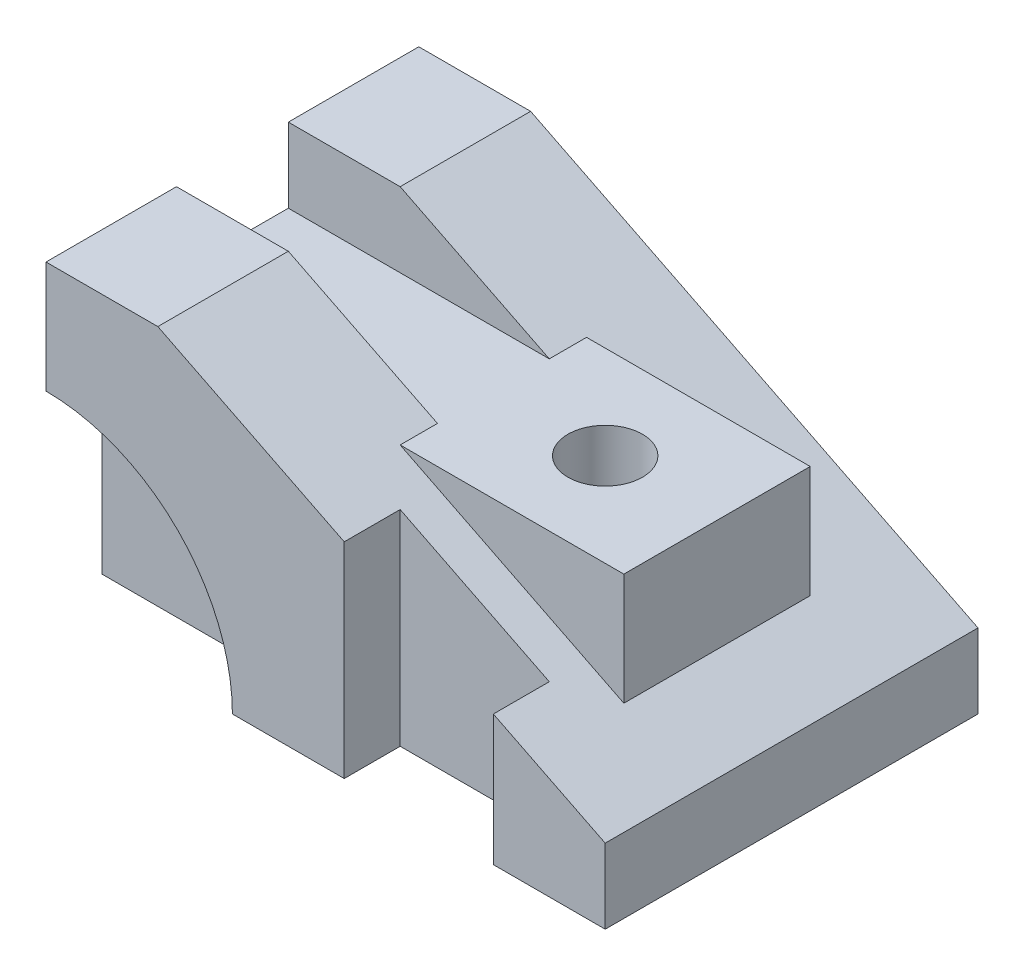
ISO-10303-21;
HEADER;
FILE_DESCRIPTION(('STEP AP214'),'2;1');
FILE_NAME('part.step','',(''),(''),'','','');
FILE_SCHEMA(('AUTOMOTIVE_DESIGN { 1 0 10303 214 1 1 1 1 }'));
ENDSEC;
DATA;
#1=APPLICATION_CONTEXT('core data for automotive mechanical design processes');
#2=APPLICATION_PROTOCOL_DEFINITION('international standard','automotive_design',2000,#1);
#3=PRODUCT_CONTEXT('',#1,'mechanical');
#4=PRODUCT('Part','Part','',(#3));
#5=PRODUCT_RELATED_PRODUCT_CATEGORY('part','',(#4));
#6=PRODUCT_DEFINITION_FORMATION('','',#4);
#7=PRODUCT_DEFINITION_CONTEXT('part definition',#1,'design');
#8=PRODUCT_DEFINITION('design','',#6,#7);
#9=PRODUCT_DEFINITION_SHAPE('','',#8);
#10=(LENGTH_UNIT() NAMED_UNIT(*) SI_UNIT(.MILLI.,.METRE.));
#11=(NAMED_UNIT(*) PLANE_ANGLE_UNIT() SI_UNIT($,.RADIAN.));
#12=(NAMED_UNIT(*) SI_UNIT($,.STERADIAN.) SOLID_ANGLE_UNIT());
#13=UNCERTAINTY_MEASURE_WITH_UNIT(LENGTH_MEASURE(1.E-05),#10,'distance_accuracy_value','');
#14=(GEOMETRIC_REPRESENTATION_CONTEXT(3) GLOBAL_UNCERTAINTY_ASSIGNED_CONTEXT((#13)) GLOBAL_UNIT_ASSIGNED_CONTEXT((#10,
#11,#12)) REPRESENTATION_CONTEXT('',''));
#15=CARTESIAN_POINT('',(0.,0.,0.));
#16=DIRECTION('',(0.,0.,1.));
#17=DIRECTION('',(1.,0.,0.));
#18=AXIS2_PLACEMENT_3D('',#15,#16,#17);
#19=CARTESIAN_POINT('',(0.,0.,50.));
#20=DIRECTION('',(0.,0.,1.));
#21=DIRECTION('',(1.,0.,0.));
#22=AXIS2_PLACEMENT_3D('',#19,#20,#21);
#23=PLANE('',#22);
#24=DIRECTION('',(0.,-1.,0.));
#25=VECTOR('',#24,1.);
#26=CARTESIAN_POINT('',(80.,0.,50.));
#27=LINE('',#26,#25);
#28=CARTESIAN_POINT('',(80.,55.,50.));
#29=VERTEX_POINT('',#28);
#30=CARTESIAN_POINT('',(80.,0.,50.));
#31=VERTEX_POINT('',#30);
#32=EDGE_CURVE('E11',#29,#31,#27,.T.);
#33=ORIENTED_EDGE('',*,*,#32,.F.);
#34=DIRECTION('',(-0.894427190999916,0.447213595499958,0.));
#35=VECTOR('',#34,1.);
#36=CARTESIAN_POINT('',(150.,20.,50.));
#37=LINE('',#36,#35);
#38=CARTESIAN_POINT('',(30.,80.,50.));
#39=VERTEX_POINT('',#38);
#40=EDGE_CURVE('E331',#29,#39,#37,.T.);
#41=ORIENTED_EDGE('',*,*,#40,.T.);
#42=DIRECTION('',(-1.,0.,0.));
#43=VECTOR('',#42,1.);
#44=CARTESIAN_POINT('',(30.,80.,50.));
#45=LINE('',#44,#43);
#46=CARTESIAN_POINT('',(0.,80.,50.));
#47=VERTEX_POINT('',#46);
#48=EDGE_CURVE('E336',#39,#47,#45,.T.);
#49=ORIENTED_EDGE('',*,*,#48,.T.);
#50=DIRECTION('',(0.,-1.,0.));
#51=VECTOR('',#50,1.);
#52=CARTESIAN_POINT('',(0.,80.,50.));
#53=LINE('',#52,#51);
#54=CARTESIAN_POINT('',(0.,50.,50.));
#55=VERTEX_POINT('',#54);
#56=EDGE_CURVE('E320',#47,#55,#53,.T.);
#57=ORIENTED_EDGE('',*,*,#56,.T.);
#58=CARTESIAN_POINT('',(0.,0.,50.));
#59=DIRECTION('',(0.,0.,1.));
#60=DIRECTION('',(1.,0.,0.));
#61=AXIS2_PLACEMENT_3D('',#58,#59,#60);
#62=CIRCLE('',#61,50.);
#63=CARTESIAN_POINT('',(50.,0.,50.));
#64=VERTEX_POINT('',#63);
#65=EDGE_CURVE('E275',#64,#55,#62,.T.);
#66=ORIENTED_EDGE('',*,*,#65,.F.);
#67=DIRECTION('',(1.,0.,0.));
#68=VECTOR('',#67,1.);
#69=CARTESIAN_POINT('',(0.,0.,50.));
#70=LINE('',#69,#68);
#71=EDGE_CURVE('E325',#64,#31,#70,.T.);
#72=ORIENTED_EDGE('',*,*,#71,.T.);
#73=EDGE_LOOP('',(#33,#41,#49,#57,#66,#72));
#74=FACE_BOUND('',#73,.T.);
#75=ADVANCED_FACE('F45',(#74),#23,.T.);
#76=CARTESIAN_POINT('',(0.,80.,50.));
#77=DIRECTION('',(1.,0.,0.));
#78=DIRECTION('',(0.,1.,0.));
#79=AXIS2_PLACEMENT_3D('',#76,#77,#78);
#80=PLANE('',#79);
#81=DIRECTION('',(0.,1.,0.));
#82=VECTOR('',#81,1.);
#83=CARTESIAN_POINT('',(0.,80.,15.));
#84=LINE('',#83,#82);
#85=CARTESIAN_POINT('',(0.,60.,15.));
#86=VERTEX_POINT('',#85);
#87=CARTESIAN_POINT('',(0.,80.,15.));
#88=VERTEX_POINT('',#87);
#89=EDGE_CURVE('E240',#86,#88,#84,.T.);
#90=ORIENTED_EDGE('',*,*,#89,.F.);
#91=DIRECTION('',(0.,0.,1.));
#92=VECTOR('',#91,1.);
#93=CARTESIAN_POINT('',(0.,60.,50.));
#94=LINE('',#93,#92);
#95=CARTESIAN_POINT('',(0.,60.,-15.));
#96=VERTEX_POINT('',#95);
#97=EDGE_CURVE('E243',#96,#86,#94,.T.);
#98=ORIENTED_EDGE('',*,*,#97,.F.);
#99=DIRECTION('',(0.,1.,0.));
#100=VECTOR('',#99,1.);
#101=CARTESIAN_POINT('',(0.,80.,-15.));
#102=LINE('',#101,#100);
#103=CARTESIAN_POINT('',(0.,80.,-15.));
#104=VERTEX_POINT('',#103);
#105=EDGE_CURVE('E233',#96,#104,#102,.T.);
#106=ORIENTED_EDGE('',*,*,#105,.T.);
#107=DIRECTION('',(0.,0.,-1.));
#108=VECTOR('',#107,1.);
#109=CARTESIAN_POINT('',(0.,80.,50.));
#110=LINE('',#109,#108);
#111=CARTESIAN_POINT('',(0.,80.,-50.));
#112=VERTEX_POINT('',#111);
#113=EDGE_CURVE('E339',#104,#112,#110,.T.);
#114=ORIENTED_EDGE('',*,*,#113,.T.);
#115=DIRECTION('',(0.,-1.,0.));
#116=VECTOR('',#115,1.);
#117=CARTESIAN_POINT('',(0.,80.,-50.));
#118=LINE('',#117,#116);
#119=CARTESIAN_POINT('',(0.,0.,-50.));
#120=VERTEX_POINT('',#119);
#121=EDGE_CURVE('E300',#112,#120,#118,.T.);
#122=ORIENTED_EDGE('',*,*,#121,.T.);
#123=DIRECTION('',(0.,0.,-1.));
#124=VECTOR('',#123,1.);
#125=CARTESIAN_POINT('',(0.,0.,50.));
#126=LINE('',#125,#124);
#127=CARTESIAN_POINT('',(0.,0.,35.));
#128=VERTEX_POINT('',#127);
#129=EDGE_CURVE('E355',#128,#120,#126,.T.);
#130=ORIENTED_EDGE('',*,*,#129,.F.);
#131=DIRECTION('',(0.,-1.,0.));
#132=VECTOR('',#131,1.);
#133=CARTESIAN_POINT('',(0.,80.,35.));
#134=LINE('',#133,#132);
#135=CARTESIAN_POINT('',(0.,50.,35.));
#136=VERTEX_POINT('',#135);
#137=EDGE_CURVE('E297',#136,#128,#134,.T.);
#138=ORIENTED_EDGE('',*,*,#137,.F.);
#139=DIRECTION('',(0.,0.,1.));
#140=VECTOR('',#139,1.);
#141=CARTESIAN_POINT('',(0.,50.,35.));
#142=LINE('',#141,#140);
#143=EDGE_CURVE('E293',#136,#55,#142,.T.);
#144=ORIENTED_EDGE('',*,*,#143,.T.);
#145=ORIENTED_EDGE('',*,*,#56,.F.);
#146=EDGE_CURVE('E340',#47,#88,#110,.T.);
#147=ORIENTED_EDGE('',*,*,#146,.T.);
#148=EDGE_LOOP('',(#90,#98,#106,#114,#122,#130,#138,#144,#145,#147));
#149=FACE_BOUND('',#148,.T.);
#150=ADVANCED_FACE('F47',(#149),#80,.F.);
#151=CARTESIAN_POINT('',(150.,20.,50.));
#152=DIRECTION('',(-0.447213595499958,-0.894427190999916,0.));
#153=DIRECTION('',(0.894427190999916,-0.447213595499958,0.));
#154=AXIS2_PLACEMENT_3D('',#151,#152,#153);
#155=PLANE('',#154);
#156=ORIENTED_EDGE('',*,*,#40,.F.);
#157=DIRECTION('',(0.,0.,-1.));
#158=VECTOR('',#157,1.);
#159=CARTESIAN_POINT('',(80.,55.,50.0000000000001));
#160=LINE('',#159,#158);
#161=CARTESIAN_POINT('',(80.,55.,35.));
#162=VERTEX_POINT('',#161);
#163=EDGE_CURVE('E205',#29,#162,#160,.T.);
#164=ORIENTED_EDGE('',*,*,#163,.T.);
#165=DIRECTION('',(0.894427190999916,-0.447213595499958,0.));
#166=VECTOR('',#165,1.);
#167=CARTESIAN_POINT('',(150.,20.,35.));
#168=LINE('',#167,#166);
#169=CARTESIAN_POINT('',(120.,35.,35.));
#170=VERTEX_POINT('',#169);
#171=EDGE_CURVE('E177',#162,#170,#168,.T.);
#172=ORIENTED_EDGE('',*,*,#171,.T.);
#173=DIRECTION('',(0.,0.,1.));
#174=VECTOR('',#173,1.);
#175=CARTESIAN_POINT('',(120.,35.,50.));
#176=LINE('',#175,#174);
#177=CARTESIAN_POINT('',(120.,35.,50.));
#178=VERTEX_POINT('',#177);
#179=EDGE_CURVE('E200',#170,#178,#176,.T.);
#180=ORIENTED_EDGE('',*,*,#179,.T.);
#181=CARTESIAN_POINT('',(150.,20.,50.));
#182=VERTEX_POINT('',#181);
#183=EDGE_CURVE('E332',#182,#178,#37,.T.);
#184=ORIENTED_EDGE('',*,*,#183,.F.);
#185=DIRECTION('',(0.,0.,-1.));
#186=VECTOR('',#185,1.);
#187=CARTESIAN_POINT('',(150.,20.,50.));
#188=LINE('',#187,#186);
#189=CARTESIAN_POINT('',(150.,20.,-50.));
#190=VERTEX_POINT('',#189);
#191=EDGE_CURVE('E349',#182,#190,#188,.T.);
#192=ORIENTED_EDGE('',*,*,#191,.T.);
#193=DIRECTION('',(-0.894427190999916,0.447213595499958,0.));
#194=VECTOR('',#193,1.);
#195=CARTESIAN_POINT('',(150.,20.,-50.));
#196=LINE('',#195,#194);
#197=CARTESIAN_POINT('',(30.,80.,-50.));
#198=VERTEX_POINT('',#197);
#199=EDGE_CURVE('E312',#190,#198,#196,.T.);
#200=ORIENTED_EDGE('',*,*,#199,.T.);
#201=DIRECTION('',(0.,0.,-1.));
#202=VECTOR('',#201,1.);
#203=CARTESIAN_POINT('',(30.,80.,50.));
#204=LINE('',#203,#202);
#205=CARTESIAN_POINT('',(30.,80.,-15.));
#206=VERTEX_POINT('',#205);
#207=EDGE_CURVE('E344',#206,#198,#204,.T.);
#208=ORIENTED_EDGE('',*,*,#207,.F.);
#209=DIRECTION('',(0.894427190999916,-0.447213595499958,0.));
#210=VECTOR('',#209,1.);
#211=CARTESIAN_POINT('',(150.,20.,-15.));
#212=LINE('',#211,#210);
#213=CARTESIAN_POINT('',(70.,60.,-15.));
#214=VERTEX_POINT('',#213);
#215=EDGE_CURVE('E69',#206,#214,#212,.T.);
#216=ORIENTED_EDGE('',*,*,#215,.T.);
#217=DIRECTION('',(0.,0.,1.));
#218=VECTOR('',#217,1.);
#219=CARTESIAN_POINT('',(70.,60.,-25.));
#220=LINE('',#219,#218);
#221=CARTESIAN_POINT('',(70.,60.,-25.));
#222=VERTEX_POINT('',#221);
#223=EDGE_CURVE('E271',#222,#214,#220,.T.);
#224=ORIENTED_EDGE('',*,*,#223,.F.);
#225=DIRECTION('',(0.894427190999916,-0.447213595499958,0.));
#226=VECTOR('',#225,1.);
#227=CARTESIAN_POINT('',(130.,30.,-25.));
#228=LINE('',#227,#226);
#229=CARTESIAN_POINT('',(130.,30.,-25.));
#230=VERTEX_POINT('',#229);
#231=EDGE_CURVE('E258',#222,#230,#228,.T.);
#232=ORIENTED_EDGE('',*,*,#231,.T.);
#233=DIRECTION('',(0.,0.,1.));
#234=VECTOR('',#233,1.);
#235=CARTESIAN_POINT('',(130.,30.,-25.));
#236=LINE('',#235,#234);
#237=CARTESIAN_POINT('',(130.,30.,25.));
#238=VERTEX_POINT('',#237);
#239=EDGE_CURVE('E270',#230,#238,#236,.T.);
#240=ORIENTED_EDGE('',*,*,#239,.T.);
#241=DIRECTION('',(0.894427190999916,-0.447213595499958,0.));
#242=VECTOR('',#241,1.);
#243=CARTESIAN_POINT('',(130.,30.,25.));
#244=LINE('',#243,#242);
#245=CARTESIAN_POINT('',(70.,60.,25.));
#246=VERTEX_POINT('',#245);
#247=EDGE_CURVE('E246',#246,#238,#244,.T.);
#248=ORIENTED_EDGE('',*,*,#247,.F.);
#249=CARTESIAN_POINT('',(70.,60.,15.));
#250=VERTEX_POINT('',#249);
#251=EDGE_CURVE('E276',#250,#246,#220,.T.);
#252=ORIENTED_EDGE('',*,*,#251,.F.);
#253=DIRECTION('',(0.894427190999916,-0.447213595499958,0.));
#254=VECTOR('',#253,1.);
#255=CARTESIAN_POINT('',(150.,20.,15.));
#256=LINE('',#255,#254);
#257=CARTESIAN_POINT('',(30.,80.,15.));
#258=VERTEX_POINT('',#257);
#259=EDGE_CURVE('E237',#258,#250,#256,.T.);
#260=ORIENTED_EDGE('',*,*,#259,.F.);
#261=EDGE_CURVE('E345',#39,#258,#204,.T.);
#262=ORIENTED_EDGE('',*,*,#261,.F.);
#263=EDGE_LOOP('',(#156,#164,#172,#180,#184,#192,#200,#208,#216,#224,#232,#240,#248,#252,#260,#262));
#264=FACE_BOUND('',#263,.T.);
#265=ADVANCED_FACE('F366',(#264),#155,.F.);
#266=CARTESIAN_POINT('',(30.,80.,50.));
#267=DIRECTION('',(0.,-1.,0.));
#268=DIRECTION('',(0.,0.,-1.));
#269=AXIS2_PLACEMENT_3D('',#266,#267,#268);
#270=PLANE('',#269);
#271=DIRECTION('',(1.,0.,0.));
#272=VECTOR('',#271,1.);
#273=CARTESIAN_POINT('',(-10.3475579263211,80.,15.));
#274=LINE('',#273,#272);
#275=EDGE_CURVE('E219',#88,#258,#274,.T.);
#276=ORIENTED_EDGE('',*,*,#275,.F.);
#277=ORIENTED_EDGE('',*,*,#146,.F.);
#278=ORIENTED_EDGE('',*,*,#48,.F.);
#279=ORIENTED_EDGE('',*,*,#261,.T.);
#280=EDGE_LOOP('',(#276,#277,#278,#279));
#281=FACE_BOUND('',#280,.T.);
#282=ADVANCED_FACE('F435',(#281),#270,.F.);
#283=CARTESIAN_POINT('',(0.,0.,50.));
#284=DIRECTION('',(0.,1.,0.));
#285=DIRECTION('',(0.,0.,1.));
#286=AXIS2_PLACEMENT_3D('',#283,#284,#285);
#287=PLANE('',#286);
#288=CARTESIAN_POINT('',(100.,0.,0.));
#289=DIRECTION('',(0.,1.,0.));
#290=DIRECTION('',(0.,0.,1.));
#291=AXIS2_PLACEMENT_3D('',#288,#289,#290);
#292=CIRCLE('',#291,9.99999999999999);
#293=CARTESIAN_POINT('',(100.,0.,9.99999999999999));
#294=VERTEX_POINT('',#293);
#295=EDGE_CURVE('E211',#294,#294,#292,.T.);
#296=ORIENTED_EDGE('',*,*,#295,.T.);
#297=EDGE_LOOP('',(#296));
#298=FACE_BOUND('',#297,.T.);
#299=DIRECTION('',(1.,0.,0.));
#300=VECTOR('',#299,1.);
#301=CARTESIAN_POINT('',(80.,0.,35.));
#302=LINE('',#301,#300);
#303=CARTESIAN_POINT('',(80.,0.,35.));
#304=VERTEX_POINT('',#303);
#305=CARTESIAN_POINT('',(120.,0.,35.));
#306=VERTEX_POINT('',#305);
#307=EDGE_CURVE('E175',#304,#306,#302,.T.);
#308=ORIENTED_EDGE('',*,*,#307,.F.);
#309=DIRECTION('',(0.,0.,-1.));
#310=VECTOR('',#309,1.);
#311=CARTESIAN_POINT('',(80.,0.,50.));
#312=LINE('',#311,#310);
#313=EDGE_CURVE('E184',#31,#304,#312,.T.);
#314=ORIENTED_EDGE('',*,*,#313,.F.);
#315=ORIENTED_EDGE('',*,*,#71,.F.);
#316=DIRECTION('',(0.,0.,1.));
#317=VECTOR('',#316,1.);
#318=CARTESIAN_POINT('',(50.,0.,35.));
#319=LINE('',#318,#317);
#320=CARTESIAN_POINT('',(50.,0.,35.));
#321=VERTEX_POINT('',#320);
#322=EDGE_CURVE('E287',#64,#321,#319,.F.);
#323=ORIENTED_EDGE('',*,*,#322,.T.);
#324=DIRECTION('',(1.,0.,0.));
#325=VECTOR('',#324,1.);
#326=CARTESIAN_POINT('',(0.,0.,35.));
#327=LINE('',#326,#325);
#328=EDGE_CURVE('E358',#128,#321,#327,.T.);
#329=ORIENTED_EDGE('',*,*,#328,.F.);
#330=ORIENTED_EDGE('',*,*,#129,.T.);
#331=DIRECTION('',(1.,0.,0.));
#332=VECTOR('',#331,1.);
#333=CARTESIAN_POINT('',(0.,0.,-50.));
#334=LINE('',#333,#332);
#335=CARTESIAN_POINT('',(150.,0.,-50.));
#336=VERTEX_POINT('',#335);
#337=EDGE_CURVE('E304',#120,#336,#334,.T.);
#338=ORIENTED_EDGE('',*,*,#337,.T.);
#339=DIRECTION('',(0.,0.,-1.));
#340=VECTOR('',#339,1.);
#341=CARTESIAN_POINT('',(150.,0.,50.));
#342=LINE('',#341,#340);
#343=CARTESIAN_POINT('',(150.,0.,50.));
#344=VERTEX_POINT('',#343);
#345=EDGE_CURVE('E352',#344,#336,#342,.T.);
#346=ORIENTED_EDGE('',*,*,#345,.F.);
#347=CARTESIAN_POINT('',(120.,0.,50.));
#348=VERTEX_POINT('',#347);
#349=EDGE_CURVE('E324',#348,#344,#70,.T.);
#350=ORIENTED_EDGE('',*,*,#349,.F.);
#351=DIRECTION('',(0.,0.,1.));
#352=VECTOR('',#351,1.);
#353=CARTESIAN_POINT('',(120.,0.,50.));
#354=LINE('',#353,#352);
#355=EDGE_CURVE('E61',#306,#348,#354,.T.);
#356=ORIENTED_EDGE('',*,*,#355,.F.);
#357=EDGE_LOOP('',(#308,#314,#315,#323,#329,#330,#338,#346,#350,#356));
#358=FACE_BOUND('',#357,.T.);
#359=ADVANCED_FACE('F192',(#298,#358),#287,.F.);
#360=CARTESIAN_POINT('',(150.,0.,50.));
#361=DIRECTION('',(-1.,0.,0.));
#362=DIRECTION('',(0.,0.,1.));
#363=AXIS2_PLACEMENT_3D('',#360,#361,#362);
#364=PLANE('',#363);
#365=ORIENTED_EDGE('',*,*,#345,.T.);
#366=DIRECTION('',(0.,1.,0.));
#367=VECTOR('',#366,1.);
#368=CARTESIAN_POINT('',(150.,0.,-50.));
#369=LINE('',#368,#367);
#370=EDGE_CURVE('E308',#336,#190,#369,.T.);
#371=ORIENTED_EDGE('',*,*,#370,.T.);
#372=ORIENTED_EDGE('',*,*,#191,.F.);
#373=DIRECTION('',(0.,1.,0.));
#374=VECTOR('',#373,1.);
#375=CARTESIAN_POINT('',(150.,0.,50.));
#376=LINE('',#375,#374);
#377=EDGE_CURVE('E328',#344,#182,#376,.T.);
#378=ORIENTED_EDGE('',*,*,#377,.F.);
#379=EDGE_LOOP('',(#365,#371,#372,#378));
#380=FACE_BOUND('',#379,.T.);
#381=ADVANCED_FACE('F372',(#380),#364,.F.);
#382=ORIENTED_EDGE('',*,*,#113,.F.);
#383=DIRECTION('',(1.,0.,0.));
#384=VECTOR('',#383,1.);
#385=CARTESIAN_POINT('',(-10.3475579263211,80.,-15.));
#386=LINE('',#385,#384);
#387=EDGE_CURVE('E222',#104,#206,#386,.T.);
#388=ORIENTED_EDGE('',*,*,#387,.T.);
#389=ORIENTED_EDGE('',*,*,#207,.T.);
#390=DIRECTION('',(-1.,0.,0.));
#391=VECTOR('',#390,1.);
#392=CARTESIAN_POINT('',(30.,80.,-50.));
#393=LINE('',#392,#391);
#394=EDGE_CURVE('E316',#198,#112,#393,.T.);
#395=ORIENTED_EDGE('',*,*,#394,.T.);
#396=EDGE_LOOP('',(#382,#388,#389,#395));
#397=FACE_BOUND('',#396,.T.);
#398=ADVANCED_FACE('F383',(#397),#270,.F.);
#399=DIRECTION('',(0.,1.,0.));
#400=VECTOR('',#399,1.);
#401=CARTESIAN_POINT('',(120.,0.,50.));
#402=LINE('',#401,#400);
#403=EDGE_CURVE('E54',#348,#178,#402,.T.);
#404=ORIENTED_EDGE('',*,*,#403,.F.);
#405=ORIENTED_EDGE('',*,*,#349,.T.);
#406=ORIENTED_EDGE('',*,*,#377,.T.);
#407=ORIENTED_EDGE('',*,*,#183,.T.);
#408=EDGE_LOOP('',(#404,#405,#406,#407));
#409=FACE_BOUND('',#408,.T.);
#410=ADVANCED_FACE('F367',(#409),#23,.T.);
#411=CARTESIAN_POINT('',(0.,0.,-50.));
#412=DIRECTION('',(0.,0.,1.));
#413=DIRECTION('',(1.,0.,0.));
#414=AXIS2_PLACEMENT_3D('',#411,#412,#413);
#415=PLANE('',#414);
#416=ORIENTED_EDGE('',*,*,#121,.F.);
#417=ORIENTED_EDGE('',*,*,#394,.F.);
#418=ORIENTED_EDGE('',*,*,#199,.F.);
#419=ORIENTED_EDGE('',*,*,#370,.F.);
#420=ORIENTED_EDGE('',*,*,#337,.F.);
#421=EDGE_LOOP('',(#416,#417,#418,#419,#420));
#422=FACE_BOUND('',#421,.T.);
#423=ADVANCED_FACE('F379',(#422),#415,.F.);
#424=CARTESIAN_POINT('',(0.,0.,35.));
#425=DIRECTION('',(0.,0.,1.));
#426=DIRECTION('',(1.,0.,0.));
#427=AXIS2_PLACEMENT_3D('',#424,#425,#426);
#428=PLANE('',#427);
#429=ORIENTED_EDGE('',*,*,#137,.T.);
#430=ORIENTED_EDGE('',*,*,#328,.T.);
#431=CARTESIAN_POINT('',(0.,0.,35.));
#432=DIRECTION('',(0.,0.,1.));
#433=DIRECTION('',(1.,0.,0.));
#434=AXIS2_PLACEMENT_3D('',#431,#432,#433);
#435=CIRCLE('',#434,50.);
#436=EDGE_CURVE('E283',#321,#136,#435,.T.);
#437=ORIENTED_EDGE('',*,*,#436,.T.);
#438=EDGE_LOOP('',(#429,#430,#437));
#439=FACE_BOUND('',#438,.T.);
#440=ADVANCED_FACE('F433',(#439),#428,.T.);
#441=CARTESIAN_POINT('',(0.,0.,35.));
#442=DIRECTION('',(0.,0.,1.));
#443=DIRECTION('',(1.,0.,0.));
#444=AXIS2_PLACEMENT_3D('',#441,#442,#443);
#445=CYLINDRICAL_SURFACE('',#444,50.);
#446=ORIENTED_EDGE('',*,*,#436,.F.);
#447=ORIENTED_EDGE('',*,*,#322,.F.);
#448=ORIENTED_EDGE('',*,*,#65,.T.);
#449=ORIENTED_EDGE('',*,*,#143,.F.);
#450=EDGE_LOOP('',(#446,#447,#448,#449));
#451=FACE_BOUND('',#450,.T.);
#452=ADVANCED_FACE('F514',(#451),#445,.F.);
#453=CARTESIAN_POINT('',(70.,60.,-25.));
#454=DIRECTION('',(0.,1.,0.));
#455=DIRECTION('',(0.,0.,1.));
#456=AXIS2_PLACEMENT_3D('',#453,#454,#455);
#457=PLANE('',#456);
#458=CARTESIAN_POINT('',(100.,60.,0.));
#459=DIRECTION('',(0.,1.,0.));
#460=DIRECTION('',(0.,0.,1.));
#461=AXIS2_PLACEMENT_3D('',#458,#459,#460);
#462=CIRCLE('',#461,9.99999999999999);
#463=CARTESIAN_POINT('',(100.,60.,9.99999999999999));
#464=VERTEX_POINT('',#463);
#465=EDGE_CURVE('E210',#464,#464,#462,.T.);
#466=ORIENTED_EDGE('',*,*,#465,.F.);
#467=EDGE_LOOP('',(#466));
#468=FACE_BOUND('',#467,.T.);
#469=ORIENTED_EDGE('',*,*,#223,.T.);
#470=DIRECTION('',(1.,0.,0.));
#471=VECTOR('',#470,1.);
#472=CARTESIAN_POINT('',(-10.3475579263211,60.,-15.));
#473=LINE('',#472,#471);
#474=EDGE_CURVE('E223',#96,#214,#473,.T.);
#475=ORIENTED_EDGE('',*,*,#474,.F.);
#476=ORIENTED_EDGE('',*,*,#97,.T.);
#477=DIRECTION('',(1.,0.,0.));
#478=VECTOR('',#477,1.);
#479=CARTESIAN_POINT('',(-10.3475579263211,60.,15.));
#480=LINE('',#479,#478);
#481=EDGE_CURVE('E215',#86,#250,#480,.T.);
#482=ORIENTED_EDGE('',*,*,#481,.T.);
#483=ORIENTED_EDGE('',*,*,#251,.T.);
#484=DIRECTION('',(-1.,0.,0.));
#485=VECTOR('',#484,1.);
#486=CARTESIAN_POINT('',(70.,60.,25.));
#487=LINE('',#486,#485);
#488=CARTESIAN_POINT('',(130.,60.,25.));
#489=VERTEX_POINT('',#488);
#490=EDGE_CURVE('E254',#489,#246,#487,.T.);
#491=ORIENTED_EDGE('',*,*,#490,.F.);
#492=DIRECTION('',(0.,0.,1.));
#493=VECTOR('',#492,1.);
#494=CARTESIAN_POINT('',(130.,60.,-25.));
#495=LINE('',#494,#493);
#496=CARTESIAN_POINT('',(130.,60.,-25.));
#497=VERTEX_POINT('',#496);
#498=EDGE_CURVE('E277',#497,#489,#495,.T.);
#499=ORIENTED_EDGE('',*,*,#498,.F.);
#500=DIRECTION('',(-1.,0.,0.));
#501=VECTOR('',#500,1.);
#502=CARTESIAN_POINT('',(70.,60.,-25.));
#503=LINE('',#502,#501);
#504=EDGE_CURVE('E266',#497,#222,#503,.T.);
#505=ORIENTED_EDGE('',*,*,#504,.T.);
#506=EDGE_LOOP('',(#469,#475,#476,#482,#483,#491,#499,#505));
#507=FACE_BOUND('',#506,.T.);
#508=ADVANCED_FACE('F392',(#468,#507),#457,.T.);
#509=CARTESIAN_POINT('',(130.,60.,-25.));
#510=DIRECTION('',(1.,0.,0.));
#511=DIRECTION('',(0.,0.,-1.));
#512=AXIS2_PLACEMENT_3D('',#509,#510,#511);
#513=PLANE('',#512);
#514=ORIENTED_EDGE('',*,*,#498,.T.);
#515=DIRECTION('',(0.,1.,0.));
#516=VECTOR('',#515,1.);
#517=CARTESIAN_POINT('',(130.,60.,25.));
#518=LINE('',#517,#516);
#519=EDGE_CURVE('E250',#238,#489,#518,.T.);
#520=ORIENTED_EDGE('',*,*,#519,.F.);
#521=ORIENTED_EDGE('',*,*,#239,.F.);
#522=DIRECTION('',(0.,1.,0.));
#523=VECTOR('',#522,1.);
#524=CARTESIAN_POINT('',(130.,60.,-25.));
#525=LINE('',#524,#523);
#526=EDGE_CURVE('E262',#230,#497,#525,.T.);
#527=ORIENTED_EDGE('',*,*,#526,.T.);
#528=EDGE_LOOP('',(#514,#520,#521,#527));
#529=FACE_BOUND('',#528,.T.);
#530=ADVANCED_FACE('F401',(#529),#513,.T.);
#531=CARTESIAN_POINT('',(0.,0.,-25.));
#532=DIRECTION('',(0.,0.,1.));
#533=DIRECTION('',(1.,0.,0.));
#534=AXIS2_PLACEMENT_3D('',#531,#532,#533);
#535=PLANE('',#534);
#536=ORIENTED_EDGE('',*,*,#231,.F.);
#537=ORIENTED_EDGE('',*,*,#504,.F.);
#538=ORIENTED_EDGE('',*,*,#526,.F.);
#539=EDGE_LOOP('',(#536,#537,#538));
#540=FACE_BOUND('',#539,.T.);
#541=ADVANCED_FACE('F405',(#540),#535,.F.);
#542=CARTESIAN_POINT('',(0.,0.,25.));
#543=DIRECTION('',(0.,0.,1.));
#544=DIRECTION('',(1.,0.,0.));
#545=AXIS2_PLACEMENT_3D('',#542,#543,#544);
#546=PLANE('',#545);
#547=ORIENTED_EDGE('',*,*,#247,.T.);
#548=ORIENTED_EDGE('',*,*,#519,.T.);
#549=ORIENTED_EDGE('',*,*,#490,.T.);
#550=EDGE_LOOP('',(#547,#548,#549));
#551=FACE_BOUND('',#550,.T.);
#552=ADVANCED_FACE('F397',(#551),#546,.T.);
#553=CARTESIAN_POINT('',(-10.3475579263211,80.,15.));
#554=DIRECTION('',(0.,0.,-1.));
#555=DIRECTION('',(-1.,0.,0.));
#556=AXIS2_PLACEMENT_3D('',#553,#554,#555);
#557=PLANE('',#556);
#558=ORIENTED_EDGE('',*,*,#89,.T.);
#559=ORIENTED_EDGE('',*,*,#275,.T.);
#560=ORIENTED_EDGE('',*,*,#259,.T.);
#561=ORIENTED_EDGE('',*,*,#481,.F.);
#562=EDGE_LOOP('',(#558,#559,#560,#561));
#563=FACE_BOUND('',#562,.T.);
#564=ADVANCED_FACE('F412',(#563),#557,.T.);
#565=CARTESIAN_POINT('',(-10.3475579263211,80.,-15.));
#566=DIRECTION('',(0.,0.,-1.));
#567=DIRECTION('',(-1.,0.,0.));
#568=AXIS2_PLACEMENT_3D('',#565,#566,#567);
#569=PLANE('',#568);
#570=ORIENTED_EDGE('',*,*,#474,.T.);
#571=ORIENTED_EDGE('',*,*,#215,.F.);
#572=ORIENTED_EDGE('',*,*,#387,.F.);
#573=ORIENTED_EDGE('',*,*,#105,.F.);
#574=EDGE_LOOP('',(#570,#571,#572,#573));
#575=FACE_BOUND('',#574,.T.);
#576=ADVANCED_FACE('F457',(#575),#569,.F.);
#577=CARTESIAN_POINT('',(100.,0.,0.));
#578=DIRECTION('',(0.,1.,0.));
#579=DIRECTION('',(0.,0.,1.));
#580=AXIS2_PLACEMENT_3D('',#577,#578,#579);
#581=CYLINDRICAL_SURFACE('',#580,9.99999999999999);
#582=CARTESIAN_POINT('',(100.,0.,9.99999999999999));
#583=CARTESIAN_POINT('',(100.,0.624999999999999,9.99999999999999));
#584=CARTESIAN_POINT('',(100.,1.25,9.99999999999999));
#585=CARTESIAN_POINT('',(100.,2.5,9.99999999999999));
#586=CARTESIAN_POINT('',(100.,3.125,9.99999999999999));
#587=CARTESIAN_POINT('',(100.,4.375,9.99999999999999));
#588=CARTESIAN_POINT('',(100.,5.,9.99999999999999));
#589=CARTESIAN_POINT('',(100.,6.25,9.99999999999999));
#590=CARTESIAN_POINT('',(100.,6.875,9.99999999999999));
#591=CARTESIAN_POINT('',(100.,8.125,9.99999999999999));
#592=CARTESIAN_POINT('',(100.,8.75,9.99999999999999));
#593=CARTESIAN_POINT('',(100.,10.,9.99999999999999));
#594=CARTESIAN_POINT('',(100.,10.625,9.99999999999999));
#595=CARTESIAN_POINT('',(100.,11.875,9.99999999999999));
#596=CARTESIAN_POINT('',(100.,12.5,9.99999999999999));
#597=CARTESIAN_POINT('',(100.,13.75,9.99999999999999));
#598=CARTESIAN_POINT('',(100.,14.375,9.99999999999999));
#599=CARTESIAN_POINT('',(100.,15.625,9.99999999999999));
#600=CARTESIAN_POINT('',(100.,16.25,9.99999999999999));
#601=CARTESIAN_POINT('',(100.,17.5,9.99999999999999));
#602=CARTESIAN_POINT('',(100.,18.125,9.99999999999999));
#603=CARTESIAN_POINT('',(100.,19.375,9.99999999999999));
#604=CARTESIAN_POINT('',(100.,20.,9.99999999999999));
#605=CARTESIAN_POINT('',(100.,21.25,9.99999999999999));
#606=CARTESIAN_POINT('',(100.,21.875,9.99999999999999));
#607=CARTESIAN_POINT('',(100.,23.125,9.99999999999999));
#608=CARTESIAN_POINT('',(100.,23.75,9.99999999999999));
#609=CARTESIAN_POINT('',(100.,25.,9.99999999999999));
#610=CARTESIAN_POINT('',(100.,25.625,9.99999999999999));
#611=CARTESIAN_POINT('',(100.,26.875,9.99999999999999));
#612=CARTESIAN_POINT('',(100.,27.5,9.99999999999999));
#613=CARTESIAN_POINT('',(100.,28.75,9.99999999999999));
#614=CARTESIAN_POINT('',(100.,29.375,9.99999999999999));
#615=CARTESIAN_POINT('',(100.,30.625,9.99999999999999));
#616=CARTESIAN_POINT('',(100.,31.25,9.99999999999999));
#617=CARTESIAN_POINT('',(100.,32.5,9.99999999999999));
#618=CARTESIAN_POINT('',(100.,33.125,9.99999999999999));
#619=CARTESIAN_POINT('',(100.,34.375,9.99999999999999));
#620=CARTESIAN_POINT('',(100.,35.,9.99999999999999));
#621=CARTESIAN_POINT('',(100.,36.25,9.99999999999999));
#622=CARTESIAN_POINT('',(100.,36.875,9.99999999999999));
#623=CARTESIAN_POINT('',(100.,38.125,9.99999999999999));
#624=CARTESIAN_POINT('',(100.,38.75,9.99999999999999));
#625=CARTESIAN_POINT('',(100.,40.,9.99999999999999));
#626=CARTESIAN_POINT('',(100.,40.625,9.99999999999999));
#627=CARTESIAN_POINT('',(100.,41.875,9.99999999999999));
#628=CARTESIAN_POINT('',(100.,42.5,9.99999999999999));
#629=CARTESIAN_POINT('',(100.,43.75,9.99999999999999));
#630=CARTESIAN_POINT('',(100.,44.375,9.99999999999999));
#631=CARTESIAN_POINT('',(100.,45.625,9.99999999999999));
#632=CARTESIAN_POINT('',(100.,46.25,9.99999999999999));
#633=CARTESIAN_POINT('',(100.,47.5,9.99999999999999));
#634=CARTESIAN_POINT('',(100.,48.125,9.99999999999999));
#635=CARTESIAN_POINT('',(100.,49.375,9.99999999999999));
#636=CARTESIAN_POINT('',(100.,50.,9.99999999999999));
#637=CARTESIAN_POINT('',(100.,51.25,9.99999999999999));
#638=CARTESIAN_POINT('',(100.,51.875,9.99999999999999));
#639=CARTESIAN_POINT('',(100.,53.125,9.99999999999999));
#640=CARTESIAN_POINT('',(100.,53.75,9.99999999999999));
#641=CARTESIAN_POINT('',(100.,55.,9.99999999999999));
#642=CARTESIAN_POINT('',(100.,55.625,9.99999999999999));
#643=CARTESIAN_POINT('',(100.,56.875,9.99999999999999));
#644=CARTESIAN_POINT('',(100.,57.5,9.99999999999999));
#645=CARTESIAN_POINT('',(100.,58.75,9.99999999999999));
#646=CARTESIAN_POINT('',(100.,59.375,9.99999999999999));
#647=CARTESIAN_POINT('',(100.,60.,9.99999999999999));
#648=B_SPLINE_CURVE_WITH_KNOTS('',3,(#582,#583,#584,#585,#586,#587,#588,#589,#590,#591,#592,
#593,#594,#595,#596,#597,#598,#599,#600,#601,#602,#603,#604,#605,#606,#607,#608,#609,#610,#611,
#612,#613,#614,#615,#616,#617,#618,#619,#620,#621,#622,#623,#624,#625,#626,#627,#628,#629,#630,
#631,#632,#633,#634,#635,#636,#637,#638,#639,#640,#641,#642,#643,#644,#645,#646,#647),
.UNSPECIFIED.,.F.,.F.,(4,2,2,2,2,2,2,2,2,2,2,2,2,2,2,2,2,2,2,2,2,2,2,2,2,2,2,2,2,2,2,2,4),(0.,
1.875,3.75,5.625,7.5,9.375,11.25,13.125,15.,16.875,18.75,20.625,22.5,24.375,26.25,28.125,30.,
31.875,33.75,35.625,37.5,39.375,41.25,43.125,45.,46.875,48.75,50.625,52.5,54.375,56.25,58.125,
60.),.UNSPECIFIED.);
#649=EDGE_CURVE('BSEAM462',#294,#464,#648,.T.);
#650=ORIENTED_EDGE('',*,*,#295,.F.);
#651=ORIENTED_EDGE('',*,*,#465,.T.);
#652=ORIENTED_EDGE('',*,*,#649,.T.);
#653=ORIENTED_EDGE('',*,*,#649,.F.);
#654=EDGE_LOOP('',(#650,#652,#651,#653));
#655=FACE_BOUND('',#654,.T.);
#656=ADVANCED_FACE('F462',(#655),#581,.F.);
#657=CARTESIAN_POINT('',(80.,80.,35.));
#658=DIRECTION('',(0.,0.,-1.));
#659=DIRECTION('',(-1.,0.,0.));
#660=AXIS2_PLACEMENT_3D('',#657,#658,#659);
#661=PLANE('',#660);
#662=DIRECTION('',(0.,-1.,0.));
#663=VECTOR('',#662,1.);
#664=CARTESIAN_POINT('',(80.,80.,35.));
#665=LINE('',#664,#663);
#666=EDGE_CURVE('E170',#162,#304,#665,.T.);
#667=ORIENTED_EDGE('',*,*,#666,.T.);
#668=ORIENTED_EDGE('',*,*,#307,.T.);
#669=DIRECTION('',(0.,-1.,0.));
#670=VECTOR('',#669,1.);
#671=CARTESIAN_POINT('',(120.,80.,35.));
#672=LINE('',#671,#670);
#673=EDGE_CURVE('E181',#170,#306,#672,.T.);
#674=ORIENTED_EDGE('',*,*,#673,.F.);
#675=ORIENTED_EDGE('',*,*,#171,.F.);
#676=EDGE_LOOP('',(#667,#668,#674,#675));
#677=FACE_BOUND('',#676,.T.);
#678=ADVANCED_FACE('F172',(#677),#661,.F.);
#679=CARTESIAN_POINT('',(80.,80.,50.));
#680=DIRECTION('',(-1.,0.,0.));
#681=DIRECTION('',(0.,0.,1.));
#682=AXIS2_PLACEMENT_3D('',#679,#680,#681);
#683=PLANE('',#682);
#684=ORIENTED_EDGE('',*,*,#32,.T.);
#685=ORIENTED_EDGE('',*,*,#313,.T.);
#686=ORIENTED_EDGE('',*,*,#666,.F.);
#687=ORIENTED_EDGE('',*,*,#163,.F.);
#688=EDGE_LOOP('',(#684,#685,#686,#687));
#689=FACE_BOUND('',#688,.T.);
#690=ADVANCED_FACE('F185',(#689),#683,.F.);
#691=CARTESIAN_POINT('',(120.,80.,50.));
#692=DIRECTION('',(1.,0.,0.));
#693=DIRECTION('',(0.,0.,-1.));
#694=AXIS2_PLACEMENT_3D('',#691,#692,#693);
#695=PLANE('',#694);
#696=ORIENTED_EDGE('',*,*,#673,.T.);
#697=ORIENTED_EDGE('',*,*,#355,.T.);
#698=ORIENTED_EDGE('',*,*,#403,.T.);
#699=ORIENTED_EDGE('',*,*,#179,.F.);
#700=EDGE_LOOP('',(#696,#697,#698,#699));
#701=FACE_BOUND('',#700,.T.);
#702=ADVANCED_FACE('F361',(#701),#695,.F.);
#703=CLOSED_SHELL('',(#75,#150,#265,#282,#359,#381,#398,#410,#423,#440,#452,#508,#530,#541,#552,
#564,#576,#656,#678,#690,#702));
#704=MANIFOLD_SOLID_BREP('B2',#703);
#705=ADVANCED_BREP_SHAPE_REPRESENTATION('',(#18,#704),#14);
#706=SHAPE_DEFINITION_REPRESENTATION(#9,#705);
ENDSEC;
END-ISO-10303-21;
